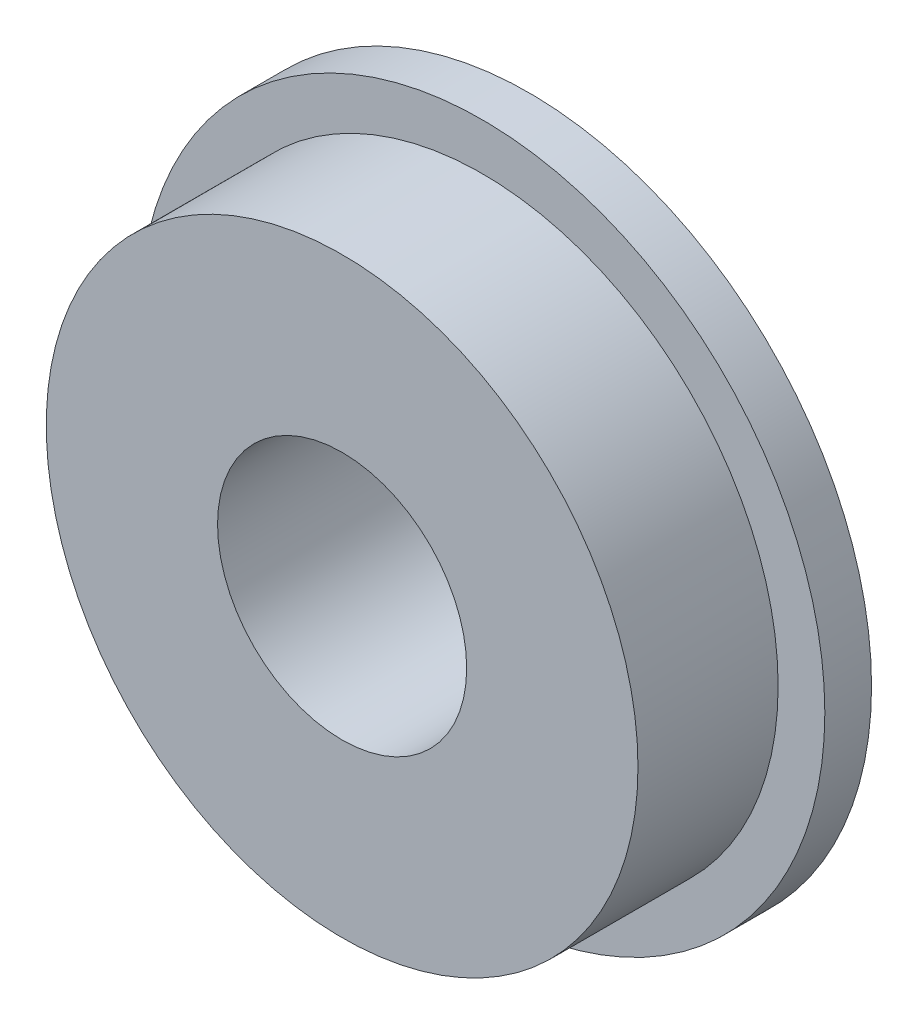
ISO-10303-21;
HEADER;
FILE_DESCRIPTION(('STEP AP214'),'2;1');
FILE_NAME('part.step','',(''),(''),'','','');
FILE_SCHEMA(('AUTOMOTIVE_DESIGN { 1 0 10303 214 1 1 1 1 }'));
ENDSEC;
DATA;
#1=APPLICATION_CONTEXT('core data for automotive mechanical design processes');
#2=APPLICATION_PROTOCOL_DEFINITION('international standard','automotive_design',2000,#1);
#3=PRODUCT_CONTEXT('',#1,'mechanical');
#4=PRODUCT('Part','Part','',(#3));
#5=PRODUCT_RELATED_PRODUCT_CATEGORY('part','',(#4));
#6=PRODUCT_DEFINITION_FORMATION('','',#4);
#7=PRODUCT_DEFINITION_CONTEXT('part definition',#1,'design');
#8=PRODUCT_DEFINITION('design','',#6,#7);
#9=PRODUCT_DEFINITION_SHAPE('','',#8);
#10=(LENGTH_UNIT() NAMED_UNIT(*) SI_UNIT(.MILLI.,.METRE.));
#11=(NAMED_UNIT(*) PLANE_ANGLE_UNIT() SI_UNIT($,.RADIAN.));
#12=(NAMED_UNIT(*) SI_UNIT($,.STERADIAN.) SOLID_ANGLE_UNIT());
#13=UNCERTAINTY_MEASURE_WITH_UNIT(LENGTH_MEASURE(1.E-05),#10,'distance_accuracy_value','');
#14=(GEOMETRIC_REPRESENTATION_CONTEXT(3) GLOBAL_UNCERTAINTY_ASSIGNED_CONTEXT((#13)) GLOBAL_UNIT_ASSIGNED_CONTEXT((#10,
#11,#12)) REPRESENTATION_CONTEXT('',''));
#15=CARTESIAN_POINT('',(0.,0.,0.));
#16=DIRECTION('',(0.,0.,1.));
#17=DIRECTION('',(1.,0.,0.));
#18=AXIS2_PLACEMENT_3D('',#15,#16,#17);
#19=CARTESIAN_POINT('',(0.,0.,1.5));
#20=DIRECTION('',(0.,0.,-1.));
#21=DIRECTION('',(-1.,0.,0.));
#22=AXIS2_PLACEMENT_3D('',#19,#20,#21);
#23=CYLINDRICAL_SURFACE('',#22,11.);
#24=CARTESIAN_POINT('',(0.,0.,1.5));
#25=DIRECTION('',(0.,0.,1.));
#26=DIRECTION('',(1.,0.,0.));
#27=AXIS2_PLACEMENT_3D('',#24,#25,#26);
#28=CIRCLE('',#27,11.);
#29=CARTESIAN_POINT('',(11.,0.,1.5));
#30=VERTEX_POINT('',#29);
#31=EDGE_CURVE('E41',#30,#30,#28,.T.);
#32=ORIENTED_EDGE('',*,*,#31,.F.);
#33=EDGE_LOOP('',(#32));
#34=FACE_BOUND('',#33,.T.);
#35=CARTESIAN_POINT('',(0.,0.,0.));
#36=DIRECTION('',(0.,0.,1.));
#37=DIRECTION('',(1.,0.,0.));
#38=AXIS2_PLACEMENT_3D('',#35,#36,#37);
#39=CIRCLE('',#38,11.);
#40=CARTESIAN_POINT('',(11.,0.,0.));
#41=VERTEX_POINT('',#40);
#42=EDGE_CURVE('E37',#41,#41,#39,.T.);
#43=ORIENTED_EDGE('',*,*,#42,.T.);
#44=EDGE_LOOP('',(#43));
#45=FACE_BOUND('',#44,.T.);
#46=ADVANCED_FACE('F34',(#34,#45),#23,.T.);
#47=CARTESIAN_POINT('',(0.,0.,1.5));
#48=DIRECTION('',(0.,0.,1.));
#49=DIRECTION('',(1.,0.,0.));
#50=AXIS2_PLACEMENT_3D('',#47,#48,#49);
#51=PLANE('',#50);
#52=CARTESIAN_POINT('',(0.,0.,1.5));
#53=DIRECTION('',(0.,0.,1.));
#54=DIRECTION('',(1.,0.,0.));
#55=AXIS2_PLACEMENT_3D('',#52,#53,#54);
#56=CIRCLE('',#55,9.5);
#57=CARTESIAN_POINT('',(9.5,0.,1.5));
#58=VERTEX_POINT('',#57);
#59=EDGE_CURVE('E10',#58,#58,#56,.T.);
#60=ORIENTED_EDGE('',*,*,#59,.F.);
#61=EDGE_LOOP('',(#60));
#62=FACE_BOUND('',#61,.T.);
#63=ORIENTED_EDGE('',*,*,#31,.T.);
#64=EDGE_LOOP('',(#63));
#65=FACE_BOUND('',#64,.T.);
#66=ADVANCED_FACE('F78',(#62,#65),#51,.T.);
#67=CARTESIAN_POINT('',(0.,0.,0.));
#68=DIRECTION('',(0.,0.,1.));
#69=DIRECTION('',(1.,0.,0.));
#70=AXIS2_PLACEMENT_3D('',#67,#68,#69);
#71=PLANE('',#70);
#72=CARTESIAN_POINT('',(0.,0.,0.));
#73=DIRECTION('',(0.,0.,1.));
#74=DIRECTION('',(1.,0.,0.));
#75=AXIS2_PLACEMENT_3D('',#72,#73,#74);
#76=CIRCLE('',#75,4.);
#77=CARTESIAN_POINT('',(4.,0.,0.));
#78=VERTEX_POINT('',#77);
#79=EDGE_CURVE('E50',#78,#78,#76,.T.);
#80=ORIENTED_EDGE('',*,*,#79,.T.);
#81=EDGE_LOOP('',(#80));
#82=FACE_BOUND('',#81,.T.);
#83=ORIENTED_EDGE('',*,*,#42,.F.);
#84=EDGE_LOOP('',(#83));
#85=FACE_BOUND('',#84,.T.);
#86=ADVANCED_FACE('F57',(#82,#85),#71,.F.);
#87=CARTESIAN_POINT('',(0.,0.,6.));
#88=DIRECTION('',(0.,0.,-1.));
#89=DIRECTION('',(-1.,0.,0.));
#90=AXIS2_PLACEMENT_3D('',#87,#88,#89);
#91=CYLINDRICAL_SURFACE('',#90,9.5);
#92=CARTESIAN_POINT('',(0.,0.,6.));
#93=DIRECTION('',(0.,0.,1.));
#94=DIRECTION('',(1.,0.,0.));
#95=AXIS2_PLACEMENT_3D('',#92,#93,#94);
#96=CIRCLE('',#95,9.5);
#97=CARTESIAN_POINT('',(9.5,0.,6.));
#98=VERTEX_POINT('',#97);
#99=EDGE_CURVE('E47',#98,#98,#96,.T.);
#100=ORIENTED_EDGE('',*,*,#99,.F.);
#101=EDGE_LOOP('',(#100));
#102=FACE_BOUND('',#101,.T.);
#103=ORIENTED_EDGE('',*,*,#59,.T.);
#104=EDGE_LOOP('',(#103));
#105=FACE_BOUND('',#104,.T.);
#106=ADVANCED_FACE('F69',(#102,#105),#91,.T.);
#107=CARTESIAN_POINT('',(0.,0.,6.));
#108=DIRECTION('',(0.,0.,1.));
#109=DIRECTION('',(1.,0.,0.));
#110=AXIS2_PLACEMENT_3D('',#107,#108,#109);
#111=PLANE('',#110);
#112=CARTESIAN_POINT('',(0.,0.,6.));
#113=DIRECTION('',(0.,0.,1.));
#114=DIRECTION('',(1.,0.,0.));
#115=AXIS2_PLACEMENT_3D('',#112,#113,#114);
#116=CIRCLE('',#115,4.);
#117=CARTESIAN_POINT('',(4.,0.,6.));
#118=VERTEX_POINT('',#117);
#119=EDGE_CURVE('E51',#118,#118,#116,.T.);
#120=ORIENTED_EDGE('',*,*,#119,.F.);
#121=EDGE_LOOP('',(#120));
#122=FACE_BOUND('',#121,.T.);
#123=ORIENTED_EDGE('',*,*,#99,.T.);
#124=EDGE_LOOP('',(#123));
#125=FACE_BOUND('',#124,.T.);
#126=ADVANCED_FACE('F63',(#122,#125),#111,.T.);
#127=CARTESIAN_POINT('',(0.,0.,0.));
#128=DIRECTION('',(0.,0.,1.));
#129=DIRECTION('',(1.,0.,0.));
#130=AXIS2_PLACEMENT_3D('',#127,#128,#129);
#131=CYLINDRICAL_SURFACE('',#130,4.);
#132=ORIENTED_EDGE('',*,*,#79,.F.);
#133=EDGE_LOOP('',(#132));
#134=FACE_BOUND('',#133,.T.);
#135=ORIENTED_EDGE('',*,*,#119,.T.);
#136=EDGE_LOOP('',(#135));
#137=FACE_BOUND('',#136,.T.);
#138=ADVANCED_FACE('F60',(#134,#137),#131,.F.);
#139=CLOSED_SHELL('',(#46,#66,#86,#106,#126,#138));
#140=MANIFOLD_SOLID_BREP('B2',#139);
#141=ADVANCED_BREP_SHAPE_REPRESENTATION('',(#18,#140),#14);
#142=SHAPE_DEFINITION_REPRESENTATION(#9,#141);
ENDSEC;
END-ISO-10303-21;
